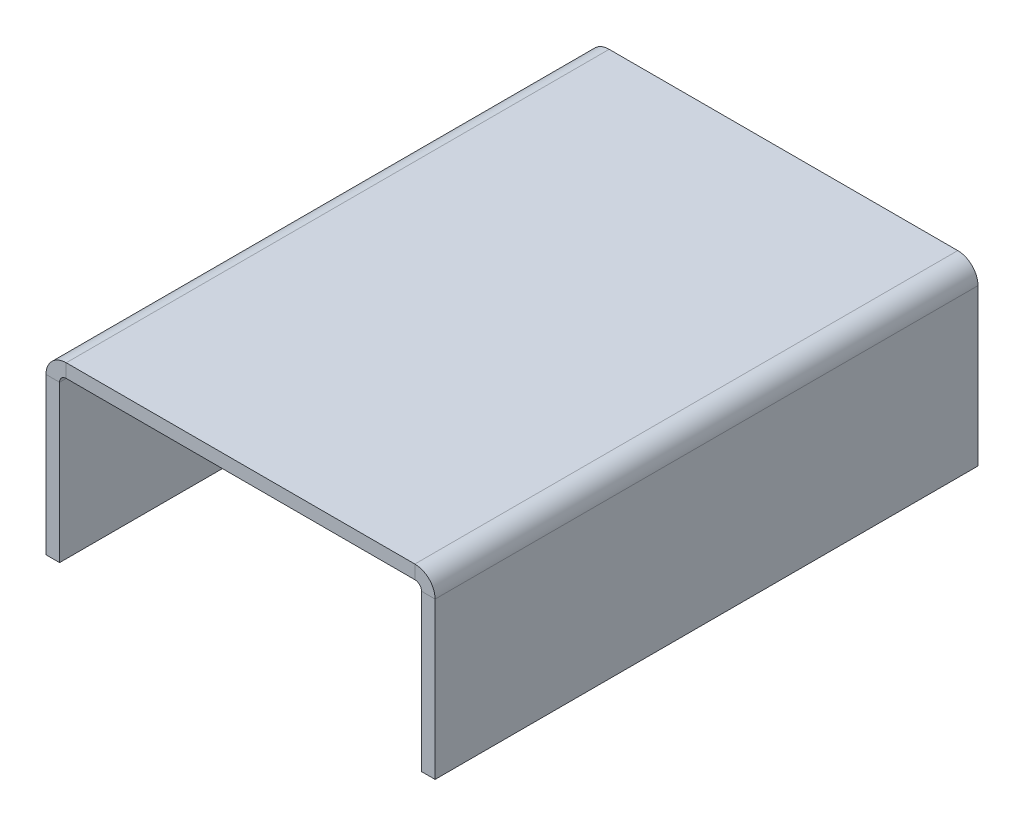
ISO-10303-21;
HEADER;
FILE_DESCRIPTION(('STEP AP214'),'2;1');
FILE_NAME('part.step','',(''),(''),'','','');
FILE_SCHEMA(('AUTOMOTIVE_DESIGN { 1 0 10303 214 1 1 1 1 }'));
ENDSEC;
DATA;
#1=APPLICATION_CONTEXT('core data for automotive mechanical design processes');
#2=APPLICATION_PROTOCOL_DEFINITION('international standard','automotive_design',2000,#1);
#3=PRODUCT_CONTEXT('',#1,'mechanical');
#4=PRODUCT('Part','Part','',(#3));
#5=PRODUCT_RELATED_PRODUCT_CATEGORY('part','',(#4));
#6=PRODUCT_DEFINITION_FORMATION('','',#4);
#7=PRODUCT_DEFINITION_CONTEXT('part definition',#1,'design');
#8=PRODUCT_DEFINITION('design','',#6,#7);
#9=PRODUCT_DEFINITION_SHAPE('','',#8);
#10=(LENGTH_UNIT() NAMED_UNIT(*) SI_UNIT(.MILLI.,.METRE.));
#11=(NAMED_UNIT(*) PLANE_ANGLE_UNIT() SI_UNIT($,.RADIAN.));
#12=(NAMED_UNIT(*) SI_UNIT($,.STERADIAN.) SOLID_ANGLE_UNIT());
#13=UNCERTAINTY_MEASURE_WITH_UNIT(LENGTH_MEASURE(1.E-05),#10,'distance_accuracy_value','');
#14=(GEOMETRIC_REPRESENTATION_CONTEXT(3) GLOBAL_UNCERTAINTY_ASSIGNED_CONTEXT((#13)) GLOBAL_UNIT_ASSIGNED_CONTEXT((#10,
#11,#12)) REPRESENTATION_CONTEXT('',''));
#15=CARTESIAN_POINT('',(0.,0.,0.));
#16=DIRECTION('',(0.,0.,1.));
#17=DIRECTION('',(1.,0.,0.));
#18=AXIS2_PLACEMENT_3D('',#15,#16,#17);
#19=CARTESIAN_POINT('',(-20.,8.2634,30.));
#20=DIRECTION('',(0.,0.,1.));
#21=DIRECTION('',(1.,0.,0.));
#22=AXIS2_PLACEMENT_3D('',#19,#20,#21);
#23=PLANE('',#22);
#24=DIRECTION('',(-1.,0.,0.));
#25=VECTOR('',#24,1.);
#26=CARTESIAN_POINT('',(-20.,8.2634,30.));
#27=LINE('',#26,#25);
#28=CARTESIAN_POINT('',(-20.,8.2634,30.));
#29=VERTEX_POINT('',#28);
#30=CARTESIAN_POINT('',(-21.5,8.2634,30.));
#31=VERTEX_POINT('',#30);
#32=EDGE_CURVE('E11',#29,#31,#27,.T.);
#33=ORIENTED_EDGE('',*,*,#32,.F.);
#34=CARTESIAN_POINT('',(-19.2634,8.2634,30.));
#35=DIRECTION('',(0.,0.,1.));
#36=DIRECTION('',(1.,0.,0.));
#37=AXIS2_PLACEMENT_3D('',#34,#35,#36);
#38=CIRCLE('',#37,0.7366);
#39=CARTESIAN_POINT('',(-19.2634,9.,30.));
#40=VERTEX_POINT('',#39);
#41=EDGE_CURVE('E242',#40,#29,#38,.T.);
#42=ORIENTED_EDGE('',*,*,#41,.F.);
#43=DIRECTION('',(0.,-1.,0.));
#44=VECTOR('',#43,1.);
#45=CARTESIAN_POINT('',(-19.2634,10.5,30.));
#46=LINE('',#45,#44);
#47=CARTESIAN_POINT('',(-19.2634,10.5,30.));
#48=VERTEX_POINT('',#47);
#49=EDGE_CURVE('E45',#48,#40,#46,.T.);
#50=ORIENTED_EDGE('',*,*,#49,.F.);
#51=CARTESIAN_POINT('',(-19.2634,8.2634,30.));
#52=DIRECTION('',(0.,0.,1.));
#53=DIRECTION('',(1.,0.,0.));
#54=AXIS2_PLACEMENT_3D('',#51,#52,#53);
#55=CIRCLE('',#54,2.2366);
#56=EDGE_CURVE('E169',#48,#31,#55,.T.);
#57=ORIENTED_EDGE('',*,*,#56,.T.);
#58=EDGE_LOOP('',(#33,#42,#50,#57));
#59=FACE_BOUND('',#58,.T.);
#60=ADVANCED_FACE('F37',(#59),#23,.T.);
#61=CARTESIAN_POINT('',(-19.2634,10.5,30.));
#62=DIRECTION('',(0.,0.,1.));
#63=DIRECTION('',(1.,0.,0.));
#64=AXIS2_PLACEMENT_3D('',#61,#62,#63);
#65=PLANE('',#64);
#66=DIRECTION('',(0.,-1.,0.));
#67=VECTOR('',#66,1.);
#68=CARTESIAN_POINT('',(-20.,-9.,30.));
#69=LINE('',#68,#67);
#70=CARTESIAN_POINT('',(-20.,-9.,30.));
#71=VERTEX_POINT('',#70);
#72=EDGE_CURVE('E246',#29,#71,#69,.T.);
#73=ORIENTED_EDGE('',*,*,#72,.F.);
#74=ORIENTED_EDGE('',*,*,#32,.T.);
#75=DIRECTION('',(0.,1.,0.));
#76=VECTOR('',#75,1.);
#77=CARTESIAN_POINT('',(-21.5,-9.,30.));
#78=LINE('',#77,#76);
#79=CARTESIAN_POINT('',(-21.5,-9.,30.));
#80=VERTEX_POINT('',#79);
#81=EDGE_CURVE('E105',#31,#80,#78,.F.);
#82=ORIENTED_EDGE('',*,*,#81,.T.);
#83=DIRECTION('',(-1.,0.,0.));
#84=VECTOR('',#83,1.);
#85=CARTESIAN_POINT('',(-20.,-9.,30.));
#86=LINE('',#85,#84);
#87=EDGE_CURVE('E517',#71,#80,#86,.T.);
#88=ORIENTED_EDGE('',*,*,#87,.F.);
#89=EDGE_LOOP('',(#73,#74,#82,#88));
#90=FACE_BOUND('',#89,.T.);
#91=ADVANCED_FACE('F295',(#90),#65,.T.);
#92=CARTESIAN_POINT('',(-19.2634,9.,-30.));
#93=DIRECTION('',(0.,0.,-1.));
#94=DIRECTION('',(-1.,0.,0.));
#95=AXIS2_PLACEMENT_3D('',#92,#93,#94);
#96=PLANE('',#95);
#97=DIRECTION('',(0.,1.,0.));
#98=VECTOR('',#97,1.);
#99=CARTESIAN_POINT('',(-19.2634,9.,-30.));
#100=LINE('',#99,#98);
#101=CARTESIAN_POINT('',(-19.2634,9.,-30.));
#102=VERTEX_POINT('',#101);
#103=CARTESIAN_POINT('',(-19.2634,10.5,-30.));
#104=VERTEX_POINT('',#103);
#105=EDGE_CURVE('E92',#102,#104,#100,.T.);
#106=ORIENTED_EDGE('',*,*,#105,.F.);
#107=CARTESIAN_POINT('',(-19.2634,8.2634,-30.));
#108=DIRECTION('',(0.,0.,1.));
#109=DIRECTION('',(1.,0.,0.));
#110=AXIS2_PLACEMENT_3D('',#107,#108,#109);
#111=CIRCLE('',#110,0.7366);
#112=CARTESIAN_POINT('',(-20.,8.2634,-30.));
#113=VERTEX_POINT('',#112);
#114=EDGE_CURVE('E184',#102,#113,#111,.T.);
#115=ORIENTED_EDGE('',*,*,#114,.T.);
#116=DIRECTION('',(1.,0.,0.));
#117=VECTOR('',#116,1.);
#118=CARTESIAN_POINT('',(-21.5,8.2634,-30.));
#119=LINE('',#118,#117);
#120=CARTESIAN_POINT('',(-21.5,8.2634,-30.));
#121=VERTEX_POINT('',#120);
#122=EDGE_CURVE('E99',#121,#113,#119,.T.);
#123=ORIENTED_EDGE('',*,*,#122,.F.);
#124=CARTESIAN_POINT('',(-19.2634,8.2634,-30.));
#125=DIRECTION('',(0.,0.,1.));
#126=DIRECTION('',(1.,0.,0.));
#127=AXIS2_PLACEMENT_3D('',#124,#125,#126);
#128=CIRCLE('',#127,2.2366);
#129=EDGE_CURVE('E203',#104,#121,#128,.T.);
#130=ORIENTED_EDGE('',*,*,#129,.F.);
#131=EDGE_LOOP('',(#106,#115,#123,#130));
#132=FACE_BOUND('',#131,.T.);
#133=ADVANCED_FACE('F299',(#132),#96,.T.);
#134=CARTESIAN_POINT('',(-21.5,8.2634,-30.));
#135=DIRECTION('',(0.,0.,-1.));
#136=DIRECTION('',(-1.,0.,0.));
#137=AXIS2_PLACEMENT_3D('',#134,#135,#136);
#138=PLANE('',#137);
#139=DIRECTION('',(-1.,0.,0.));
#140=VECTOR('',#139,1.);
#141=CARTESIAN_POINT('',(-20.,9.,-30.));
#142=LINE('',#141,#140);
#143=CARTESIAN_POINT('',(19.2634,9.,-30.));
#144=VERTEX_POINT('',#143);
#145=EDGE_CURVE('E186',#144,#102,#142,.T.);
#146=ORIENTED_EDGE('',*,*,#145,.T.);
#147=ORIENTED_EDGE('',*,*,#105,.T.);
#148=DIRECTION('',(1.,0.,0.));
#149=VECTOR('',#148,1.);
#150=CARTESIAN_POINT('',(-20.,10.5,-30.));
#151=LINE('',#150,#149);
#152=CARTESIAN_POINT('',(19.2634,10.5,-30.));
#153=VERTEX_POINT('',#152);
#154=EDGE_CURVE('E201',#153,#104,#151,.F.);
#155=ORIENTED_EDGE('',*,*,#154,.F.);
#156=DIRECTION('',(0.,-1.,0.));
#157=VECTOR('',#156,1.);
#158=CARTESIAN_POINT('',(19.2634,10.5,-30.));
#159=LINE('',#158,#157);
#160=EDGE_CURVE('E229',#153,#144,#159,.T.);
#161=ORIENTED_EDGE('',*,*,#160,.T.);
#162=EDGE_LOOP('',(#146,#147,#155,#161));
#163=FACE_BOUND('',#162,.T.);
#164=ADVANCED_FACE('F272',(#163),#138,.T.);
#165=CARTESIAN_POINT('',(19.2634,9.,30.));
#166=DIRECTION('',(0.,0.,1.));
#167=DIRECTION('',(1.,0.,0.));
#168=AXIS2_PLACEMENT_3D('',#165,#166,#167);
#169=PLANE('',#168);
#170=DIRECTION('',(0.,1.,0.));
#171=VECTOR('',#170,1.);
#172=CARTESIAN_POINT('',(19.2634,9.,30.));
#173=LINE('',#172,#171);
#174=CARTESIAN_POINT('',(19.2634,9.,30.));
#175=VERTEX_POINT('',#174);
#176=CARTESIAN_POINT('',(19.2634,10.5,30.));
#177=VERTEX_POINT('',#176);
#178=EDGE_CURVE('E133',#175,#177,#173,.T.);
#179=ORIENTED_EDGE('',*,*,#178,.F.);
#180=CARTESIAN_POINT('',(19.2634,8.2634,30.));
#181=DIRECTION('',(0.,0.,1.));
#182=DIRECTION('',(1.,0.,0.));
#183=AXIS2_PLACEMENT_3D('',#180,#181,#182);
#184=CIRCLE('',#183,0.7366);
#185=CARTESIAN_POINT('',(20.,8.2634,30.));
#186=VERTEX_POINT('',#185);
#187=EDGE_CURVE('E249',#186,#175,#184,.T.);
#188=ORIENTED_EDGE('',*,*,#187,.F.);
#189=DIRECTION('',(-1.,0.,0.));
#190=VECTOR('',#189,1.);
#191=CARTESIAN_POINT('',(21.5,8.2634,30.));
#192=LINE('',#191,#190);
#193=CARTESIAN_POINT('',(21.5,8.2634,30.));
#194=VERTEX_POINT('',#193);
#195=EDGE_CURVE('E145',#194,#186,#192,.T.);
#196=ORIENTED_EDGE('',*,*,#195,.F.);
#197=CARTESIAN_POINT('',(19.2634,8.2634,30.));
#198=DIRECTION('',(0.,0.,1.));
#199=DIRECTION('',(1.,0.,0.));
#200=AXIS2_PLACEMENT_3D('',#197,#198,#199);
#201=CIRCLE('',#200,2.2366);
#202=EDGE_CURVE('E148',#194,#177,#201,.T.);
#203=ORIENTED_EDGE('',*,*,#202,.T.);
#204=EDGE_LOOP('',(#179,#188,#196,#203));
#205=FACE_BOUND('',#204,.T.);
#206=ADVANCED_FACE('F150',(#205),#169,.T.);
#207=CARTESIAN_POINT('',(21.5,8.2634,30.));
#208=DIRECTION('',(0.,0.,1.));
#209=DIRECTION('',(1.,0.,0.));
#210=AXIS2_PLACEMENT_3D('',#207,#208,#209);
#211=PLANE('',#210);
#212=DIRECTION('',(-1.,0.,0.));
#213=VECTOR('',#212,1.);
#214=CARTESIAN_POINT('',(-20.,9.,30.));
#215=LINE('',#214,#213);
#216=EDGE_CURVE('E140',#175,#40,#215,.T.);
#217=ORIENTED_EDGE('',*,*,#216,.F.);
#218=ORIENTED_EDGE('',*,*,#178,.T.);
#219=DIRECTION('',(1.,0.,0.));
#220=VECTOR('',#219,1.);
#221=CARTESIAN_POINT('',(-20.,10.5,30.));
#222=LINE('',#221,#220);
#223=EDGE_CURVE('E137',#177,#48,#222,.F.);
#224=ORIENTED_EDGE('',*,*,#223,.T.);
#225=ORIENTED_EDGE('',*,*,#49,.T.);
#226=EDGE_LOOP('',(#217,#218,#224,#225));
#227=FACE_BOUND('',#226,.T.);
#228=ADVANCED_FACE('F135',(#227),#211,.T.);
#229=CARTESIAN_POINT('',(20.,8.2634,-30.));
#230=DIRECTION('',(0.,0.,-1.));
#231=DIRECTION('',(-1.,0.,0.));
#232=AXIS2_PLACEMENT_3D('',#229,#230,#231);
#233=PLANE('',#232);
#234=DIRECTION('',(1.,0.,0.));
#235=VECTOR('',#234,1.);
#236=CARTESIAN_POINT('',(20.,8.2634,-30.));
#237=LINE('',#236,#235);
#238=CARTESIAN_POINT('',(20.,8.2634,-30.));
#239=VERTEX_POINT('',#238);
#240=CARTESIAN_POINT('',(21.5,8.2634,-30.));
#241=VERTEX_POINT('',#240);
#242=EDGE_CURVE('E231',#239,#241,#237,.T.);
#243=ORIENTED_EDGE('',*,*,#242,.F.);
#244=CARTESIAN_POINT('',(19.2634,8.2634,-30.));
#245=DIRECTION('',(0.,0.,1.));
#246=DIRECTION('',(1.,0.,0.));
#247=AXIS2_PLACEMENT_3D('',#244,#245,#246);
#248=CIRCLE('',#247,0.7366);
#249=EDGE_CURVE('E188',#239,#144,#248,.T.);
#250=ORIENTED_EDGE('',*,*,#249,.T.);
#251=ORIENTED_EDGE('',*,*,#160,.F.);
#252=CARTESIAN_POINT('',(19.2634,8.2634,-30.));
#253=DIRECTION('',(0.,0.,1.));
#254=DIRECTION('',(1.,0.,0.));
#255=AXIS2_PLACEMENT_3D('',#252,#253,#254);
#256=CIRCLE('',#255,2.2366);
#257=EDGE_CURVE('E161',#241,#153,#256,.T.);
#258=ORIENTED_EDGE('',*,*,#257,.F.);
#259=EDGE_LOOP('',(#243,#250,#251,#258));
#260=FACE_BOUND('',#259,.T.);
#261=ADVANCED_FACE('F270',(#260),#233,.T.);
#262=CARTESIAN_POINT('',(19.2634,10.5,-30.));
#263=DIRECTION('',(0.,0.,-1.));
#264=DIRECTION('',(-1.,0.,0.));
#265=AXIS2_PLACEMENT_3D('',#262,#263,#264);
#266=PLANE('',#265);
#267=DIRECTION('',(0.,1.,0.));
#268=VECTOR('',#267,1.);
#269=CARTESIAN_POINT('',(20.,-9.,-30.));
#270=LINE('',#269,#268);
#271=CARTESIAN_POINT('',(20.,-9.,-30.));
#272=VERTEX_POINT('',#271);
#273=EDGE_CURVE('E191',#272,#239,#270,.T.);
#274=ORIENTED_EDGE('',*,*,#273,.T.);
#275=ORIENTED_EDGE('',*,*,#242,.T.);
#276=DIRECTION('',(0.,1.,0.));
#277=VECTOR('',#276,1.);
#278=CARTESIAN_POINT('',(21.5,-9.,-30.));
#279=LINE('',#278,#277);
#280=CARTESIAN_POINT('',(21.5,-9.,-30.));
#281=VERTEX_POINT('',#280);
#282=EDGE_CURVE('E197',#281,#241,#279,.T.);
#283=ORIENTED_EDGE('',*,*,#282,.F.);
#284=DIRECTION('',(-1.,0.,0.));
#285=VECTOR('',#284,1.);
#286=CARTESIAN_POINT('',(21.5,-9.,-30.));
#287=LINE('',#286,#285);
#288=EDGE_CURVE('E194',#281,#272,#287,.T.);
#289=ORIENTED_EDGE('',*,*,#288,.T.);
#290=EDGE_LOOP('',(#274,#275,#283,#289));
#291=FACE_BOUND('',#290,.T.);
#292=ADVANCED_FACE('F282',(#291),#266,.T.);
#293=CARTESIAN_POINT('',(-21.5,-9.,30.));
#294=DIRECTION('',(1.,0.,0.));
#295=DIRECTION('',(0.,0.,-1.));
#296=AXIS2_PLACEMENT_3D('',#293,#294,#295);
#297=PLANE('',#296);
#298=DIRECTION('',(0.,1.,0.));
#299=VECTOR('',#298,1.);
#300=CARTESIAN_POINT('',(-21.5,-9.,-30.));
#301=LINE('',#300,#299);
#302=CARTESIAN_POINT('',(-21.5,-9.,-30.));
#303=VERTEX_POINT('',#302);
#304=EDGE_CURVE('E175',#121,#303,#301,.F.);
#305=ORIENTED_EDGE('',*,*,#304,.T.);
#306=DIRECTION('',(0.,0.,-1.));
#307=VECTOR('',#306,1.);
#308=CARTESIAN_POINT('',(-21.5,-9.,30.));
#309=LINE('',#308,#307);
#310=EDGE_CURVE('E227',#80,#303,#309,.T.);
#311=ORIENTED_EDGE('',*,*,#310,.F.);
#312=ORIENTED_EDGE('',*,*,#81,.F.);
#313=DIRECTION('',(0.,0.,-1.));
#314=VECTOR('',#313,1.);
#315=CARTESIAN_POINT('',(-21.5,8.2634,30.));
#316=LINE('',#315,#314);
#317=EDGE_CURVE('E171',#31,#121,#316,.T.);
#318=ORIENTED_EDGE('',*,*,#317,.T.);
#319=EDGE_LOOP('',(#305,#311,#312,#318));
#320=FACE_BOUND('',#319,.T.);
#321=ADVANCED_FACE('F284',(#320),#297,.F.);
#322=CARTESIAN_POINT('',(-20.,-9.,30.));
#323=DIRECTION('',(0.,-1.,0.));
#324=DIRECTION('',(0.,0.,-1.));
#325=AXIS2_PLACEMENT_3D('',#322,#323,#324);
#326=PLANE('',#325);
#327=DIRECTION('',(-1.,0.,0.));
#328=VECTOR('',#327,1.);
#329=CARTESIAN_POINT('',(-20.,-9.,-30.));
#330=LINE('',#329,#328);
#331=CARTESIAN_POINT('',(-20.,-9.,-30.));
#332=VERTEX_POINT('',#331);
#333=EDGE_CURVE('E178',#332,#303,#330,.T.);
#334=ORIENTED_EDGE('',*,*,#333,.F.);
#335=DIRECTION('',(0.,0.,-1.));
#336=VECTOR('',#335,1.);
#337=CARTESIAN_POINT('',(-20.,-9.,30.));
#338=LINE('',#337,#336);
#339=EDGE_CURVE('E225',#71,#332,#338,.T.);
#340=ORIENTED_EDGE('',*,*,#339,.F.);
#341=ORIENTED_EDGE('',*,*,#87,.T.);
#342=ORIENTED_EDGE('',*,*,#310,.T.);
#343=EDGE_LOOP('',(#334,#340,#341,#342));
#344=FACE_BOUND('',#343,.T.);
#345=ADVANCED_FACE('F290',(#344),#326,.T.);
#346=CARTESIAN_POINT('',(-20.,-9.,30.));
#347=DIRECTION('',(1.,0.,0.));
#348=DIRECTION('',(0.,0.,-1.));
#349=AXIS2_PLACEMENT_3D('',#346,#347,#348);
#350=PLANE('',#349);
#351=DIRECTION('',(0.,-1.,0.));
#352=VECTOR('',#351,1.);
#353=CARTESIAN_POINT('',(-20.,-9.,-30.));
#354=LINE('',#353,#352);
#355=EDGE_CURVE('E181',#113,#332,#354,.T.);
#356=ORIENTED_EDGE('',*,*,#355,.F.);
#357=DIRECTION('',(0.,0.,-1.));
#358=VECTOR('',#357,1.);
#359=CARTESIAN_POINT('',(-20.,8.2634,30.));
#360=LINE('',#359,#358);
#361=EDGE_CURVE('E222',#29,#113,#360,.T.);
#362=ORIENTED_EDGE('',*,*,#361,.F.);
#363=ORIENTED_EDGE('',*,*,#72,.T.);
#364=ORIENTED_EDGE('',*,*,#339,.T.);
#365=EDGE_LOOP('',(#356,#362,#363,#364));
#366=FACE_BOUND('',#365,.T.);
#367=ADVANCED_FACE('F340',(#366),#350,.T.);
#368=CARTESIAN_POINT('',(-19.2634,8.2634,30.));
#369=DIRECTION('',(0.,0.,-1.));
#370=DIRECTION('',(-1.,0.,0.));
#371=AXIS2_PLACEMENT_3D('',#368,#369,#370);
#372=CYLINDRICAL_SURFACE('',#371,0.7366);
#373=ORIENTED_EDGE('',*,*,#114,.F.);
#374=DIRECTION('',(0.,0.,-1.));
#375=VECTOR('',#374,1.);
#376=CARTESIAN_POINT('',(-19.2634,9.,30.));
#377=LINE('',#376,#375);
#378=EDGE_CURVE('E219',#40,#102,#377,.T.);
#379=ORIENTED_EDGE('',*,*,#378,.F.);
#380=ORIENTED_EDGE('',*,*,#41,.T.);
#381=ORIENTED_EDGE('',*,*,#361,.T.);
#382=EDGE_LOOP('',(#373,#379,#380,#381));
#383=FACE_BOUND('',#382,.T.);
#384=ADVANCED_FACE('F241',(#383),#372,.F.);
#385=CARTESIAN_POINT('',(-20.,9.,30.));
#386=DIRECTION('',(0.,-1.,0.));
#387=DIRECTION('',(0.,0.,-1.));
#388=AXIS2_PLACEMENT_3D('',#385,#386,#387);
#389=PLANE('',#388);
#390=ORIENTED_EDGE('',*,*,#145,.F.);
#391=DIRECTION('',(0.,0.,-1.));
#392=VECTOR('',#391,1.);
#393=CARTESIAN_POINT('',(19.2634,9.,30.));
#394=LINE('',#393,#392);
#395=EDGE_CURVE('E216',#175,#144,#394,.T.);
#396=ORIENTED_EDGE('',*,*,#395,.F.);
#397=ORIENTED_EDGE('',*,*,#216,.T.);
#398=ORIENTED_EDGE('',*,*,#378,.T.);
#399=EDGE_LOOP('',(#390,#396,#397,#398));
#400=FACE_BOUND('',#399,.T.);
#401=ADVANCED_FACE('F248',(#400),#389,.T.);
#402=CARTESIAN_POINT('',(19.2634,8.2634,30.));
#403=DIRECTION('',(0.,0.,-1.));
#404=DIRECTION('',(-1.,0.,0.));
#405=AXIS2_PLACEMENT_3D('',#402,#403,#404);
#406=CYLINDRICAL_SURFACE('',#405,0.7366);
#407=ORIENTED_EDGE('',*,*,#249,.F.);
#408=DIRECTION('',(0.,0.,-1.));
#409=VECTOR('',#408,1.);
#410=CARTESIAN_POINT('',(20.,8.2634,30.));
#411=LINE('',#410,#409);
#412=EDGE_CURVE('E213',#186,#239,#411,.T.);
#413=ORIENTED_EDGE('',*,*,#412,.F.);
#414=ORIENTED_EDGE('',*,*,#187,.T.);
#415=ORIENTED_EDGE('',*,*,#395,.T.);
#416=EDGE_LOOP('',(#407,#413,#414,#415));
#417=FACE_BOUND('',#416,.T.);
#418=ADVANCED_FACE('F274',(#417),#406,.F.);
#419=CARTESIAN_POINT('',(20.,-9.,30.));
#420=DIRECTION('',(-1.,0.,0.));
#421=DIRECTION('',(0.,0.,1.));
#422=AXIS2_PLACEMENT_3D('',#419,#420,#421);
#423=PLANE('',#422);
#424=ORIENTED_EDGE('',*,*,#273,.F.);
#425=DIRECTION('',(0.,0.,-1.));
#426=VECTOR('',#425,1.);
#427=CARTESIAN_POINT('',(20.,-9.,30.));
#428=LINE('',#427,#426);
#429=CARTESIAN_POINT('',(20.,-9.,30.));
#430=VERTEX_POINT('',#429);
#431=EDGE_CURVE('E211',#430,#272,#428,.T.);
#432=ORIENTED_EDGE('',*,*,#431,.F.);
#433=DIRECTION('',(0.,1.,0.));
#434=VECTOR('',#433,1.);
#435=CARTESIAN_POINT('',(20.,-9.,30.));
#436=LINE('',#435,#434);
#437=EDGE_CURVE('E251',#430,#186,#436,.T.);
#438=ORIENTED_EDGE('',*,*,#437,.T.);
#439=ORIENTED_EDGE('',*,*,#412,.T.);
#440=EDGE_LOOP('',(#424,#432,#438,#439));
#441=FACE_BOUND('',#440,.T.);
#442=ADVANCED_FACE('F277',(#441),#423,.T.);
#443=CARTESIAN_POINT('',(21.5,-9.,30.));
#444=DIRECTION('',(0.,-1.,0.));
#445=DIRECTION('',(0.,0.,-1.));
#446=AXIS2_PLACEMENT_3D('',#443,#444,#445);
#447=PLANE('',#446);
#448=ORIENTED_EDGE('',*,*,#288,.F.);
#449=DIRECTION('',(0.,0.,-1.));
#450=VECTOR('',#449,1.);
#451=CARTESIAN_POINT('',(21.5,-9.,30.));
#452=LINE('',#451,#450);
#453=CARTESIAN_POINT('',(21.5,-9.,30.));
#454=VERTEX_POINT('',#453);
#455=EDGE_CURVE('E209',#454,#281,#452,.T.);
#456=ORIENTED_EDGE('',*,*,#455,.F.);
#457=DIRECTION('',(-1.,0.,0.));
#458=VECTOR('',#457,1.);
#459=CARTESIAN_POINT('',(21.5,-9.,30.));
#460=LINE('',#459,#458);
#461=EDGE_CURVE('E257',#454,#430,#460,.T.);
#462=ORIENTED_EDGE('',*,*,#461,.T.);
#463=ORIENTED_EDGE('',*,*,#431,.T.);
#464=EDGE_LOOP('',(#448,#456,#462,#463));
#465=FACE_BOUND('',#464,.T.);
#466=ADVANCED_FACE('F280',(#465),#447,.T.);
#467=CARTESIAN_POINT('',(21.5,-9.,30.));
#468=DIRECTION('',(-1.,0.,0.));
#469=DIRECTION('',(0.,0.,1.));
#470=AXIS2_PLACEMENT_3D('',#467,#468,#469);
#471=PLANE('',#470);
#472=ORIENTED_EDGE('',*,*,#282,.T.);
#473=DIRECTION('',(0.,0.,-1.));
#474=VECTOR('',#473,1.);
#475=CARTESIAN_POINT('',(21.5,8.2634,30.));
#476=LINE('',#475,#474);
#477=EDGE_CURVE('E163',#194,#241,#476,.T.);
#478=ORIENTED_EDGE('',*,*,#477,.F.);
#479=DIRECTION('',(0.,1.,0.));
#480=VECTOR('',#479,1.);
#481=CARTESIAN_POINT('',(21.5,-9.,30.));
#482=LINE('',#481,#480);
#483=EDGE_CURVE('E154',#454,#194,#482,.T.);
#484=ORIENTED_EDGE('',*,*,#483,.F.);
#485=ORIENTED_EDGE('',*,*,#455,.T.);
#486=EDGE_LOOP('',(#472,#478,#484,#485));
#487=FACE_BOUND('',#486,.T.);
#488=ADVANCED_FACE('F267',(#487),#471,.F.);
#489=CARTESIAN_POINT('',(19.2634,8.2634,30.));
#490=DIRECTION('',(0.,0.,-1.));
#491=DIRECTION('',(-1.,0.,0.));
#492=AXIS2_PLACEMENT_3D('',#489,#490,#491);
#493=CYLINDRICAL_SURFACE('',#492,2.2366);
#494=ORIENTED_EDGE('',*,*,#257,.T.);
#495=DIRECTION('',(0.,0.,-1.));
#496=VECTOR('',#495,1.);
#497=CARTESIAN_POINT('',(19.2634,10.5,30.));
#498=LINE('',#497,#496);
#499=EDGE_CURVE('E158',#177,#153,#498,.T.);
#500=ORIENTED_EDGE('',*,*,#499,.F.);
#501=ORIENTED_EDGE('',*,*,#202,.F.);
#502=ORIENTED_EDGE('',*,*,#477,.T.);
#503=EDGE_LOOP('',(#494,#500,#501,#502));
#504=FACE_BOUND('',#503,.T.);
#505=ADVANCED_FACE('F159',(#504),#493,.T.);
#506=CARTESIAN_POINT('',(-20.,10.5,30.));
#507=DIRECTION('',(0.,-1.,0.));
#508=DIRECTION('',(0.,0.,-1.));
#509=AXIS2_PLACEMENT_3D('',#506,#507,#508);
#510=PLANE('',#509);
#511=ORIENTED_EDGE('',*,*,#154,.T.);
#512=DIRECTION('',(0.,0.,-1.));
#513=VECTOR('',#512,1.);
#514=CARTESIAN_POINT('',(-19.2634,10.5,30.));
#515=LINE('',#514,#513);
#516=EDGE_CURVE('E164',#48,#104,#515,.T.);
#517=ORIENTED_EDGE('',*,*,#516,.F.);
#518=ORIENTED_EDGE('',*,*,#223,.F.);
#519=ORIENTED_EDGE('',*,*,#499,.T.);
#520=EDGE_LOOP('',(#511,#517,#518,#519));
#521=FACE_BOUND('',#520,.T.);
#522=ADVANCED_FACE('F166',(#521),#510,.F.);
#523=CARTESIAN_POINT('',(-19.2634,8.2634,30.));
#524=DIRECTION('',(0.,0.,-1.));
#525=DIRECTION('',(-1.,0.,0.));
#526=AXIS2_PLACEMENT_3D('',#523,#524,#525);
#527=CYLINDRICAL_SURFACE('',#526,2.2366);
#528=ORIENTED_EDGE('',*,*,#129,.T.);
#529=ORIENTED_EDGE('',*,*,#317,.F.);
#530=ORIENTED_EDGE('',*,*,#56,.F.);
#531=ORIENTED_EDGE('',*,*,#516,.T.);
#532=EDGE_LOOP('',(#528,#529,#530,#531));
#533=FACE_BOUND('',#532,.T.);
#534=ADVANCED_FACE('F424',(#533),#527,.T.);
#535=CARTESIAN_POINT('',(-19.2634,8.2634,30.));
#536=DIRECTION('',(0.,0.,1.));
#537=DIRECTION('',(1.,0.,0.));
#538=AXIS2_PLACEMENT_3D('',#535,#536,#537);
#539=PLANE('',#538);
#540=ORIENTED_EDGE('',*,*,#483,.T.);
#541=ORIENTED_EDGE('',*,*,#195,.T.);
#542=ORIENTED_EDGE('',*,*,#437,.F.);
#543=ORIENTED_EDGE('',*,*,#461,.F.);
#544=EDGE_LOOP('',(#540,#541,#542,#543));
#545=FACE_BOUND('',#544,.T.);
#546=ADVANCED_FACE('F263',(#545),#539,.T.);
#547=CARTESIAN_POINT('',(-19.2634,8.2634,-30.));
#548=DIRECTION('',(0.,0.,1.));
#549=DIRECTION('',(1.,0.,0.));
#550=AXIS2_PLACEMENT_3D('',#547,#548,#549);
#551=PLANE('',#550);
#552=ORIENTED_EDGE('',*,*,#304,.F.);
#553=ORIENTED_EDGE('',*,*,#122,.T.);
#554=ORIENTED_EDGE('',*,*,#355,.T.);
#555=ORIENTED_EDGE('',*,*,#333,.T.);
#556=EDGE_LOOP('',(#552,#553,#554,#555));
#557=FACE_BOUND('',#556,.T.);
#558=ADVANCED_FACE('F444',(#557),#551,.F.);
#559=CLOSED_SHELL('',(#60,#91,#133,#164,#206,#228,#261,#292,#321,#345,#367,#384,#401,#418,#442,
#466,#488,#505,#522,#534,#546,#558));
#560=MANIFOLD_SOLID_BREP('B2',#559);
#561=ADVANCED_BREP_SHAPE_REPRESENTATION('',(#18,#560),#14);
#562=SHAPE_DEFINITION_REPRESENTATION(#9,#561);
ENDSEC;
END-ISO-10303-21;
